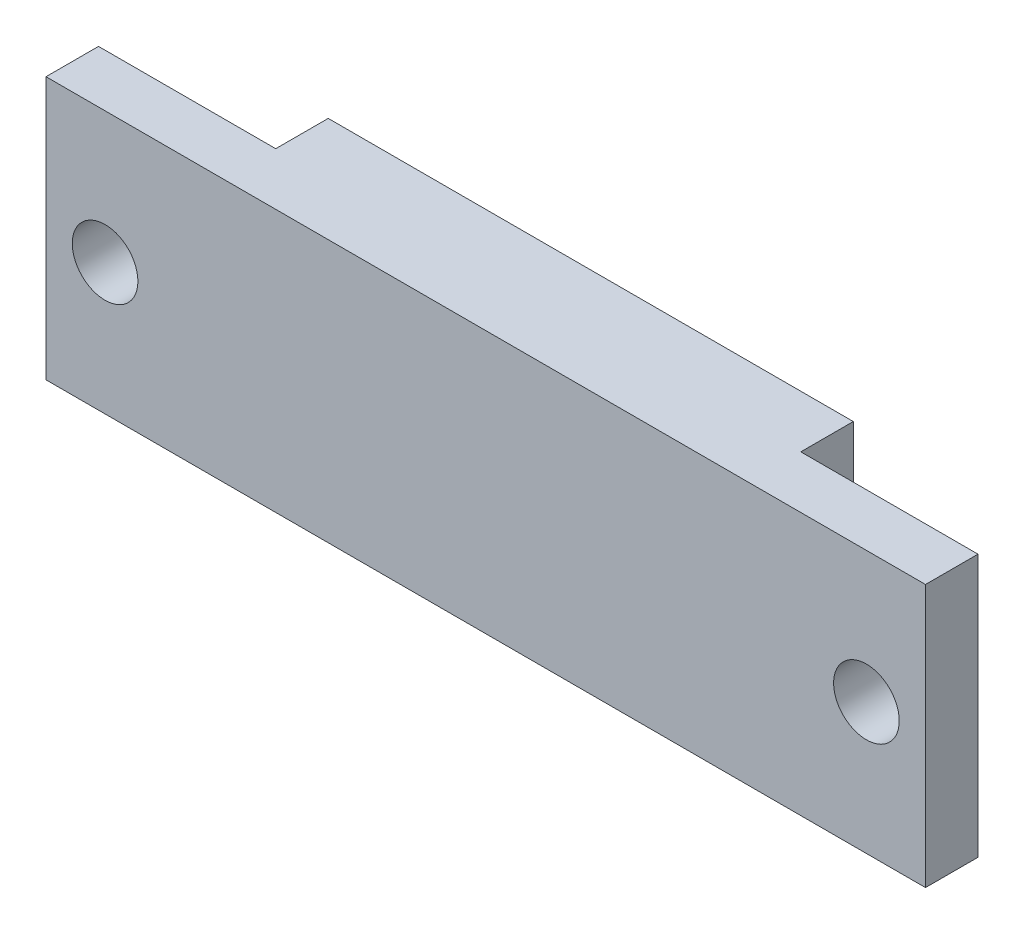
ISO-10303-21;
HEADER;
FILE_DESCRIPTION(('STEP AP214'),'2;1');
FILE_NAME('part.step','',(''),(''),'','','');
FILE_SCHEMA(('AUTOMOTIVE_DESIGN { 1 0 10303 214 1 1 1 1 }'));
ENDSEC;
DATA;
#1=APPLICATION_CONTEXT('core data for automotive mechanical design processes');
#2=APPLICATION_PROTOCOL_DEFINITION('international standard','automotive_design',2000,#1);
#3=PRODUCT_CONTEXT('',#1,'mechanical');
#4=PRODUCT('Part','Part','',(#3));
#5=PRODUCT_RELATED_PRODUCT_CATEGORY('part','',(#4));
#6=PRODUCT_DEFINITION_FORMATION('','',#4);
#7=PRODUCT_DEFINITION_CONTEXT('part definition',#1,'design');
#8=PRODUCT_DEFINITION('design','',#6,#7);
#9=PRODUCT_DEFINITION_SHAPE('','',#8);
#10=(LENGTH_UNIT() NAMED_UNIT(*) SI_UNIT(.MILLI.,.METRE.));
#11=(NAMED_UNIT(*) PLANE_ANGLE_UNIT() SI_UNIT($,.RADIAN.));
#12=(NAMED_UNIT(*) SI_UNIT($,.STERADIAN.) SOLID_ANGLE_UNIT());
#13=UNCERTAINTY_MEASURE_WITH_UNIT(LENGTH_MEASURE(1.E-05),#10,'distance_accuracy_value','');
#14=(GEOMETRIC_REPRESENTATION_CONTEXT(3) GLOBAL_UNCERTAINTY_ASSIGNED_CONTEXT((#13)) GLOBAL_UNIT_ASSIGNED_CONTEXT((#10,
#11,#12)) REPRESENTATION_CONTEXT('',''));
#15=CARTESIAN_POINT('',(0.,0.,0.));
#16=DIRECTION('',(0.,0.,1.));
#17=DIRECTION('',(1.,0.,0.));
#18=AXIS2_PLACEMENT_3D('',#15,#16,#17);
#19=CARTESIAN_POINT('',(0.,25.4,0.));
#20=DIRECTION('',(1.,0.,0.));
#21=DIRECTION('',(0.,0.,-1.));
#22=AXIS2_PLACEMENT_3D('',#19,#20,#21);
#23=PLANE('',#22);
#24=DIRECTION('',(0.,0.,1.));
#25=VECTOR('',#24,1.);
#26=CARTESIAN_POINT('',(0.,0.,0.));
#27=LINE('',#26,#25);
#28=CARTESIAN_POINT('',(0.,0.,0.));
#29=VERTEX_POINT('',#28);
#30=CARTESIAN_POINT('',(0.,0.,5.08));
#31=VERTEX_POINT('',#30);
#32=EDGE_CURVE('E146',#29,#31,#27,.T.);
#33=ORIENTED_EDGE('',*,*,#32,.T.);
#34=DIRECTION('',(0.,-1.,0.));
#35=VECTOR('',#34,1.);
#36=CARTESIAN_POINT('',(0.,25.4,5.08));
#37=LINE('',#36,#35);
#38=CARTESIAN_POINT('',(0.,25.4,5.08));
#39=VERTEX_POINT('',#38);
#40=EDGE_CURVE('E11',#39,#31,#37,.T.);
#41=ORIENTED_EDGE('',*,*,#40,.F.);
#42=DIRECTION('',(0.,0.,1.));
#43=VECTOR('',#42,1.);
#44=CARTESIAN_POINT('',(0.,25.4,0.));
#45=LINE('',#44,#43);
#46=CARTESIAN_POINT('',(0.,25.4,0.));
#47=VERTEX_POINT('',#46);
#48=EDGE_CURVE('E169',#47,#39,#45,.T.);
#49=ORIENTED_EDGE('',*,*,#48,.F.);
#50=DIRECTION('',(0.,-1.,0.));
#51=VECTOR('',#50,1.);
#52=CARTESIAN_POINT('',(0.,25.4,0.));
#53=LINE('',#52,#51);
#54=EDGE_CURVE('E142',#47,#29,#53,.T.);
#55=ORIENTED_EDGE('',*,*,#54,.T.);
#56=EDGE_LOOP('',(#33,#41,#49,#55));
#57=FACE_BOUND('',#56,.T.);
#58=ADVANCED_FACE('F43',(#57),#23,.F.);
#59=CARTESIAN_POINT('',(0.,25.4,5.08));
#60=DIRECTION('',(0.,0.,-1.));
#61=DIRECTION('',(-1.,0.,0.));
#62=AXIS2_PLACEMENT_3D('',#59,#60,#61);
#63=PLANE('',#62);
#64=CARTESIAN_POINT('',(5.71500000000001,12.7,5.08));
#65=DIRECTION('',(0.,0.,1.));
#66=DIRECTION('',(1.,0.,0.));
#67=AXIS2_PLACEMENT_3D('',#64,#65,#66);
#68=CIRCLE('',#67,3.17499999999999);
#69=CARTESIAN_POINT('',(8.88999999999999,12.7,5.08));
#70=VERTEX_POINT('',#69);
#71=EDGE_CURVE('E198',#70,#70,#68,.T.);
#72=ORIENTED_EDGE('',*,*,#71,.F.);
#73=EDGE_LOOP('',(#72));
#74=FACE_BOUND('',#73,.T.);
#75=CARTESIAN_POINT('',(79.375,12.7,5.08));
#76=DIRECTION('',(0.,0.,1.));
#77=DIRECTION('',(1.,0.,0.));
#78=AXIS2_PLACEMENT_3D('',#75,#76,#77);
#79=CIRCLE('',#78,3.17499999999998);
#80=CARTESIAN_POINT('',(82.55,12.7,5.08));
#81=VERTEX_POINT('',#80);
#82=EDGE_CURVE('E188',#81,#81,#79,.T.);
#83=ORIENTED_EDGE('',*,*,#82,.F.);
#84=EDGE_LOOP('',(#83));
#85=FACE_BOUND('',#84,.T.);
#86=DIRECTION('',(1.,0.,0.));
#87=VECTOR('',#86,1.);
#88=CARTESIAN_POINT('',(0.,0.,5.08));
#89=LINE('',#88,#87);
#90=CARTESIAN_POINT('',(85.09,0.,5.08));
#91=VERTEX_POINT('',#90);
#92=EDGE_CURVE('E150',#31,#91,#89,.T.);
#93=ORIENTED_EDGE('',*,*,#92,.T.);
#94=DIRECTION('',(0.,-1.,0.));
#95=VECTOR('',#94,1.);
#96=CARTESIAN_POINT('',(85.09,25.4,5.08));
#97=LINE('',#96,#95);
#98=CARTESIAN_POINT('',(85.09,25.4,5.08));
#99=VERTEX_POINT('',#98);
#100=EDGE_CURVE('E53',#99,#91,#97,.T.);
#101=ORIENTED_EDGE('',*,*,#100,.F.);
#102=DIRECTION('',(1.,0.,0.));
#103=VECTOR('',#102,1.);
#104=CARTESIAN_POINT('',(0.,25.4,5.08));
#105=LINE('',#104,#103);
#106=EDGE_CURVE('E105',#39,#99,#105,.T.);
#107=ORIENTED_EDGE('',*,*,#106,.F.);
#108=ORIENTED_EDGE('',*,*,#40,.T.);
#109=EDGE_LOOP('',(#93,#101,#107,#108));
#110=FACE_BOUND('',#109,.T.);
#111=ADVANCED_FACE('F240',(#74,#85,#110),#63,.F.);
#112=CARTESIAN_POINT('',(85.09,25.4,0.));
#113=DIRECTION('',(-1.,0.,0.));
#114=DIRECTION('',(0.,0.,1.));
#115=AXIS2_PLACEMENT_3D('',#112,#113,#114);
#116=PLANE('',#115);
#117=DIRECTION('',(0.,0.,-1.));
#118=VECTOR('',#117,1.);
#119=CARTESIAN_POINT('',(85.09,0.,0.));
#120=LINE('',#119,#118);
#121=CARTESIAN_POINT('',(85.09,0.,0.));
#122=VERTEX_POINT('',#121);
#123=EDGE_CURVE('E154',#91,#122,#120,.T.);
#124=ORIENTED_EDGE('',*,*,#123,.T.);
#125=DIRECTION('',(0.,-1.,0.));
#126=VECTOR('',#125,1.);
#127=CARTESIAN_POINT('',(85.09,25.4,0.));
#128=LINE('',#127,#126);
#129=CARTESIAN_POINT('',(85.09,25.4,0.));
#130=VERTEX_POINT('',#129);
#131=EDGE_CURVE('E180',#130,#122,#128,.T.);
#132=ORIENTED_EDGE('',*,*,#131,.F.);
#133=DIRECTION('',(0.,0.,-1.));
#134=VECTOR('',#133,1.);
#135=CARTESIAN_POINT('',(85.09,25.4,0.));
#136=LINE('',#135,#134);
#137=EDGE_CURVE('E205',#99,#130,#136,.T.);
#138=ORIENTED_EDGE('',*,*,#137,.F.);
#139=ORIENTED_EDGE('',*,*,#100,.T.);
#140=EDGE_LOOP('',(#124,#132,#138,#139));
#141=FACE_BOUND('',#140,.T.);
#142=ADVANCED_FACE('F244',(#141),#116,.F.);
#143=CARTESIAN_POINT('',(67.945,25.4,0.));
#144=DIRECTION('',(0.,0.,1.));
#145=DIRECTION('',(1.,0.,0.));
#146=AXIS2_PLACEMENT_3D('',#143,#144,#145);
#147=PLANE('',#146);
#148=CARTESIAN_POINT('',(79.375,12.7,0.));
#149=DIRECTION('',(0.,0.,1.));
#150=DIRECTION('',(1.,0.,0.));
#151=AXIS2_PLACEMENT_3D('',#148,#149,#150);
#152=CIRCLE('',#151,3.17499999999999);
#153=CARTESIAN_POINT('',(82.55,12.7,0.));
#154=VERTEX_POINT('',#153);
#155=EDGE_CURVE('E151',#154,#154,#152,.T.);
#156=ORIENTED_EDGE('',*,*,#155,.T.);
#157=EDGE_LOOP('',(#156));
#158=FACE_BOUND('',#157,.T.);
#159=DIRECTION('',(-1.,0.,0.));
#160=VECTOR('',#159,1.);
#161=CARTESIAN_POINT('',(67.945,0.,0.));
#162=LINE('',#161,#160);
#163=CARTESIAN_POINT('',(67.945,0.,0.));
#164=VERTEX_POINT('',#163);
#165=EDGE_CURVE('E157',#122,#164,#162,.T.);
#166=ORIENTED_EDGE('',*,*,#165,.T.);
#167=DIRECTION('',(0.,-1.,0.));
#168=VECTOR('',#167,1.);
#169=CARTESIAN_POINT('',(67.945,25.4,0.));
#170=LINE('',#169,#168);
#171=CARTESIAN_POINT('',(67.945,25.4,0.));
#172=VERTEX_POINT('',#171);
#173=EDGE_CURVE('E176',#172,#164,#170,.T.);
#174=ORIENTED_EDGE('',*,*,#173,.F.);
#175=DIRECTION('',(-1.,0.,0.));
#176=VECTOR('',#175,1.);
#177=CARTESIAN_POINT('',(67.945,25.4,0.));
#178=LINE('',#177,#176);
#179=EDGE_CURVE('E208',#130,#172,#178,.T.);
#180=ORIENTED_EDGE('',*,*,#179,.F.);
#181=ORIENTED_EDGE('',*,*,#131,.T.);
#182=EDGE_LOOP('',(#166,#174,#180,#181));
#183=FACE_BOUND('',#182,.T.);
#184=ADVANCED_FACE('F216',(#158,#183),#147,.F.);
#185=CARTESIAN_POINT('',(67.945,25.4,0.));
#186=DIRECTION('',(-1.,0.,0.));
#187=DIRECTION('',(0.,0.,1.));
#188=AXIS2_PLACEMENT_3D('',#185,#186,#187);
#189=PLANE('',#188);
#190=DIRECTION('',(0.,0.,-1.));
#191=VECTOR('',#190,1.);
#192=CARTESIAN_POINT('',(67.945,0.,0.));
#193=LINE('',#192,#191);
#194=CARTESIAN_POINT('',(67.945,0.,-5.08));
#195=VERTEX_POINT('',#194);
#196=EDGE_CURVE('E160',#164,#195,#193,.T.);
#197=ORIENTED_EDGE('',*,*,#196,.T.);
#198=DIRECTION('',(0.,-1.,0.));
#199=VECTOR('',#198,1.);
#200=CARTESIAN_POINT('',(67.945,25.4,-5.08));
#201=LINE('',#200,#199);
#202=CARTESIAN_POINT('',(67.945,25.4,-5.08));
#203=VERTEX_POINT('',#202);
#204=EDGE_CURVE('E135',#203,#195,#201,.T.);
#205=ORIENTED_EDGE('',*,*,#204,.F.);
#206=DIRECTION('',(0.,0.,-1.));
#207=VECTOR('',#206,1.);
#208=CARTESIAN_POINT('',(67.945,25.4,0.));
#209=LINE('',#208,#207);
#210=EDGE_CURVE('E124',#172,#203,#209,.T.);
#211=ORIENTED_EDGE('',*,*,#210,.F.);
#212=ORIENTED_EDGE('',*,*,#173,.T.);
#213=EDGE_LOOP('',(#197,#205,#211,#212));
#214=FACE_BOUND('',#213,.T.);
#215=ADVANCED_FACE('F220',(#214),#189,.F.);
#216=CARTESIAN_POINT('',(17.145,25.4,-5.08));
#217=DIRECTION('',(0.,0.,1.));
#218=DIRECTION('',(1.,0.,0.));
#219=AXIS2_PLACEMENT_3D('',#216,#217,#218);
#220=PLANE('',#219);
#221=DIRECTION('',(-1.,0.,0.));
#222=VECTOR('',#221,1.);
#223=CARTESIAN_POINT('',(17.145,0.,-5.08));
#224=LINE('',#223,#222);
#225=CARTESIAN_POINT('',(17.145,0.,-5.08));
#226=VERTEX_POINT('',#225);
#227=EDGE_CURVE('E133',#195,#226,#224,.T.);
#228=ORIENTED_EDGE('',*,*,#227,.T.);
#229=DIRECTION('',(0.,-1.,0.));
#230=VECTOR('',#229,1.);
#231=CARTESIAN_POINT('',(17.145,25.4,-5.08));
#232=LINE('',#231,#230);
#233=CARTESIAN_POINT('',(17.145,25.4,-5.08));
#234=VERTEX_POINT('',#233);
#235=EDGE_CURVE('E130',#234,#226,#232,.T.);
#236=ORIENTED_EDGE('',*,*,#235,.F.);
#237=DIRECTION('',(-1.,0.,0.));
#238=VECTOR('',#237,1.);
#239=CARTESIAN_POINT('',(17.145,25.4,-5.08));
#240=LINE('',#239,#238);
#241=EDGE_CURVE('E118',#203,#234,#240,.T.);
#242=ORIENTED_EDGE('',*,*,#241,.F.);
#243=ORIENTED_EDGE('',*,*,#204,.T.);
#244=EDGE_LOOP('',(#228,#236,#242,#243));
#245=FACE_BOUND('',#244,.T.);
#246=ADVANCED_FACE('F131',(#245),#220,.F.);
#247=CARTESIAN_POINT('',(17.145,25.4,0.));
#248=DIRECTION('',(1.,0.,0.));
#249=DIRECTION('',(0.,0.,-1.));
#250=AXIS2_PLACEMENT_3D('',#247,#248,#249);
#251=PLANE('',#250);
#252=DIRECTION('',(0.,0.,1.));
#253=VECTOR('',#252,1.);
#254=CARTESIAN_POINT('',(17.145,0.,0.));
#255=LINE('',#254,#253);
#256=CARTESIAN_POINT('',(17.145,0.,0.));
#257=VERTEX_POINT('',#256);
#258=EDGE_CURVE('E91',#226,#257,#255,.T.);
#259=ORIENTED_EDGE('',*,*,#258,.T.);
#260=DIRECTION('',(0.,-1.,0.));
#261=VECTOR('',#260,1.);
#262=CARTESIAN_POINT('',(17.145,25.4,0.));
#263=LINE('',#262,#261);
#264=CARTESIAN_POINT('',(17.145,25.4,0.));
#265=VERTEX_POINT('',#264);
#266=EDGE_CURVE('E136',#265,#257,#263,.T.);
#267=ORIENTED_EDGE('',*,*,#266,.F.);
#268=DIRECTION('',(0.,0.,1.));
#269=VECTOR('',#268,1.);
#270=CARTESIAN_POINT('',(17.145,25.4,0.));
#271=LINE('',#270,#269);
#272=EDGE_CURVE('E122',#234,#265,#271,.T.);
#273=ORIENTED_EDGE('',*,*,#272,.F.);
#274=ORIENTED_EDGE('',*,*,#235,.T.);
#275=EDGE_LOOP('',(#259,#267,#273,#274));
#276=FACE_BOUND('',#275,.T.);
#277=ADVANCED_FACE('F138',(#276),#251,.F.);
#278=CARTESIAN_POINT('',(0.,25.4,0.));
#279=DIRECTION('',(0.,0.,1.));
#280=DIRECTION('',(1.,0.,0.));
#281=AXIS2_PLACEMENT_3D('',#278,#279,#280);
#282=PLANE('',#281);
#283=CARTESIAN_POINT('',(5.71500000000001,12.7,0.));
#284=DIRECTION('',(0.,0.,1.));
#285=DIRECTION('',(1.,0.,0.));
#286=AXIS2_PLACEMENT_3D('',#283,#284,#285);
#287=CIRCLE('',#286,3.17499999999999);
#288=CARTESIAN_POINT('',(8.89,12.7,0.));
#289=VERTEX_POINT('',#288);
#290=EDGE_CURVE('E46',#289,#289,#287,.T.);
#291=ORIENTED_EDGE('',*,*,#290,.T.);
#292=EDGE_LOOP('',(#291));
#293=FACE_BOUND('',#292,.T.);
#294=DIRECTION('',(-1.,0.,0.));
#295=VECTOR('',#294,1.);
#296=CARTESIAN_POINT('',(0.,0.,0.));
#297=LINE('',#296,#295);
#298=EDGE_CURVE('E97',#257,#29,#297,.T.);
#299=ORIENTED_EDGE('',*,*,#298,.T.);
#300=ORIENTED_EDGE('',*,*,#54,.F.);
#301=DIRECTION('',(-1.,0.,0.));
#302=VECTOR('',#301,1.);
#303=CARTESIAN_POINT('',(0.,25.4,0.));
#304=LINE('',#303,#302);
#305=EDGE_CURVE('E62',#265,#47,#304,.T.);
#306=ORIENTED_EDGE('',*,*,#305,.F.);
#307=ORIENTED_EDGE('',*,*,#266,.T.);
#308=EDGE_LOOP('',(#299,#300,#306,#307));
#309=FACE_BOUND('',#308,.T.);
#310=ADVANCED_FACE('F228',(#293,#309),#282,.F.);
#311=CARTESIAN_POINT('',(0.,25.4,0.));
#312=DIRECTION('',(0.,1.,0.));
#313=DIRECTION('',(0.,0.,1.));
#314=AXIS2_PLACEMENT_3D('',#311,#312,#313);
#315=PLANE('',#314);
#316=ORIENTED_EDGE('',*,*,#48,.T.);
#317=ORIENTED_EDGE('',*,*,#106,.T.);
#318=ORIENTED_EDGE('',*,*,#137,.T.);
#319=ORIENTED_EDGE('',*,*,#179,.T.);
#320=ORIENTED_EDGE('',*,*,#210,.T.);
#321=ORIENTED_EDGE('',*,*,#241,.T.);
#322=ORIENTED_EDGE('',*,*,#272,.T.);
#323=ORIENTED_EDGE('',*,*,#305,.T.);
#324=EDGE_LOOP('',(#316,#317,#318,#319,#320,#321,#322,#323));
#325=FACE_BOUND('',#324,.T.);
#326=ADVANCED_FACE('F120',(#325),#315,.T.);
#327=CARTESIAN_POINT('',(0.,0.,0.));
#328=DIRECTION('',(0.,1.,0.));
#329=DIRECTION('',(0.,0.,1.));
#330=AXIS2_PLACEMENT_3D('',#327,#328,#329);
#331=PLANE('',#330);
#332=ORIENTED_EDGE('',*,*,#32,.F.);
#333=ORIENTED_EDGE('',*,*,#298,.F.);
#334=ORIENTED_EDGE('',*,*,#258,.F.);
#335=ORIENTED_EDGE('',*,*,#227,.F.);
#336=ORIENTED_EDGE('',*,*,#196,.F.);
#337=ORIENTED_EDGE('',*,*,#165,.F.);
#338=ORIENTED_EDGE('',*,*,#123,.F.);
#339=ORIENTED_EDGE('',*,*,#92,.F.);
#340=EDGE_LOOP('',(#332,#333,#334,#335,#336,#337,#338,#339));
#341=FACE_BOUND('',#340,.T.);
#342=ADVANCED_FACE('F223',(#341),#331,.F.);
#343=CARTESIAN_POINT('',(79.375,12.7,5.08));
#344=DIRECTION('',(0.,0.,1.));
#345=DIRECTION('',(1.,0.,0.));
#346=AXIS2_PLACEMENT_3D('',#343,#344,#345);
#347=CYLINDRICAL_SURFACE('',#346,3.17499999999999);
#348=ORIENTED_EDGE('',*,*,#82,.T.);
#349=EDGE_LOOP('',(#348));
#350=FACE_BOUND('',#349,.T.);
#351=ORIENTED_EDGE('',*,*,#155,.F.);
#352=EDGE_LOOP('',(#351));
#353=FACE_BOUND('',#352,.T.);
#354=ADVANCED_FACE('F284',(#350,#353),#347,.F.);
#355=CARTESIAN_POINT('',(5.71500000000001,12.7,5.08));
#356=DIRECTION('',(0.,0.,1.));
#357=DIRECTION('',(1.,0.,0.));
#358=AXIS2_PLACEMENT_3D('',#355,#356,#357);
#359=CYLINDRICAL_SURFACE('',#358,3.17499999999999);
#360=ORIENTED_EDGE('',*,*,#71,.T.);
#361=EDGE_LOOP('',(#360));
#362=FACE_BOUND('',#361,.T.);
#363=ORIENTED_EDGE('',*,*,#290,.F.);
#364=EDGE_LOOP('',(#363));
#365=FACE_BOUND('',#364,.T.);
#366=ADVANCED_FACE('F313',(#362,#365),#359,.F.);
#367=CLOSED_SHELL('',(#58,#111,#142,#184,#215,#246,#277,#310,#326,#342,#354,#366));
#368=MANIFOLD_SOLID_BREP('B2',#367);
#369=ADVANCED_BREP_SHAPE_REPRESENTATION('',(#18,#368),#14);
#370=SHAPE_DEFINITION_REPRESENTATION(#9,#369);
ENDSEC;
END-ISO-10303-21;
